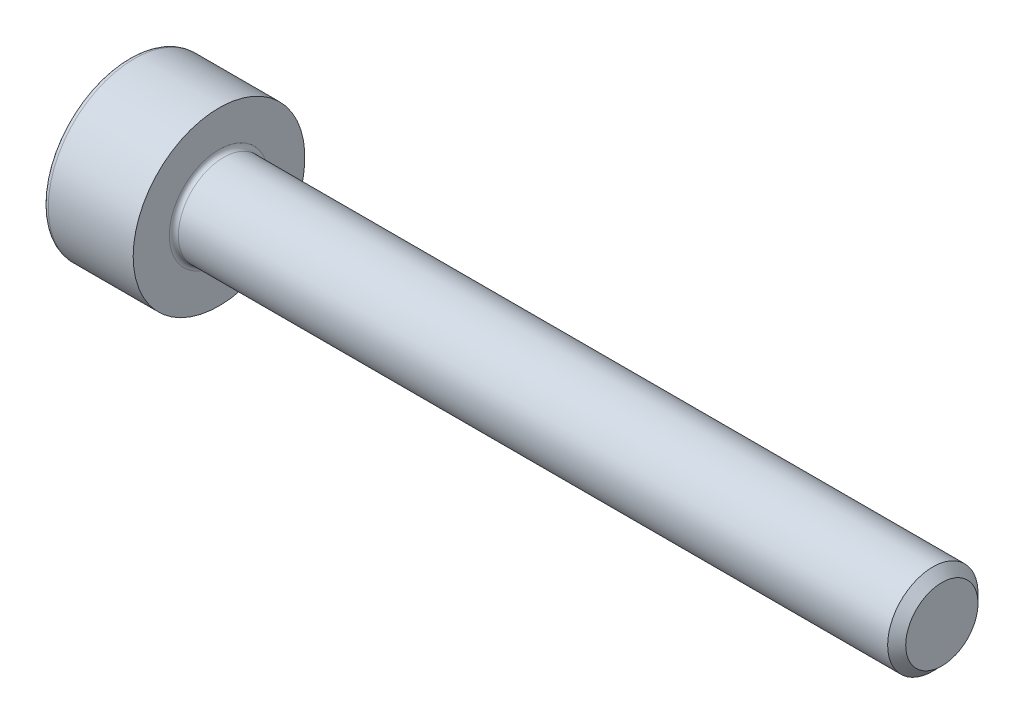
ISO-10303-21;
HEADER;
FILE_DESCRIPTION(('STEP AP214'),'2;1');
FILE_NAME('part.step','',(''),(''),'','','');
FILE_SCHEMA(('AUTOMOTIVE_DESIGN { 1 0 10303 214 1 1 1 1 }'));
ENDSEC;
DATA;
#1=APPLICATION_CONTEXT('core data for automotive mechanical design processes');
#2=APPLICATION_PROTOCOL_DEFINITION('international standard','automotive_design',2000,#1);
#3=PRODUCT_CONTEXT('',#1,'mechanical');
#4=PRODUCT('Part','Part','',(#3));
#5=PRODUCT_RELATED_PRODUCT_CATEGORY('part','',(#4));
#6=PRODUCT_DEFINITION_FORMATION('','',#4);
#7=PRODUCT_DEFINITION_CONTEXT('part definition',#1,'design');
#8=PRODUCT_DEFINITION('design','',#6,#7);
#9=PRODUCT_DEFINITION_SHAPE('','',#8);
#10=(LENGTH_UNIT() NAMED_UNIT(*) SI_UNIT(.MILLI.,.METRE.));
#11=(NAMED_UNIT(*) PLANE_ANGLE_UNIT() SI_UNIT($,.RADIAN.));
#12=(NAMED_UNIT(*) SI_UNIT($,.STERADIAN.) SOLID_ANGLE_UNIT());
#13=UNCERTAINTY_MEASURE_WITH_UNIT(LENGTH_MEASURE(1.E-05),#10,'distance_accuracy_value','');
#14=(GEOMETRIC_REPRESENTATION_CONTEXT(3) GLOBAL_UNCERTAINTY_ASSIGNED_CONTEXT((#13)) GLOBAL_UNIT_ASSIGNED_CONTEXT((#10,
#11,#12)) REPRESENTATION_CONTEXT('',''));
#15=CARTESIAN_POINT('',(0.,0.,0.));
#16=DIRECTION('',(0.,0.,1.));
#17=DIRECTION('',(1.,0.,0.));
#18=AXIS2_PLACEMENT_3D('',#15,#16,#17);
#19=CARTESIAN_POINT('',(18.0000000000048,0.,0.));
#20=DIRECTION('',(-1.,0.,0.));
#21=DIRECTION('',(0.,0.,1.));
#22=AXIS2_PLACEMENT_3D('',#19,#20,#21);
#23=PLANE('',#22);
#24=CARTESIAN_POINT('',(18.0000000000048,0.,0.));
#25=DIRECTION('',(-1.,0.,0.));
#26=DIRECTION('',(0.,0.,1.));
#27=AXIS2_PLACEMENT_3D('',#24,#25,#26);
#28=CIRCLE('',#27,0.800000000000002);
#29=CARTESIAN_POINT('',(18.0000000000048,0.,0.800000000000002));
#30=VERTEX_POINT('',#29);
#31=EDGE_CURVE('E11',#30,#30,#28,.F.);
#32=ORIENTED_EDGE('',*,*,#31,.T.);
#33=EDGE_LOOP('',(#32));
#34=FACE_BOUND('',#33,.T.);
#35=ADVANCED_FACE('F37',(#34),#23,.F.);
#36=CARTESIAN_POINT('',(0.,0.,0.));
#37=DIRECTION('',(-1.,0.,0.));
#38=DIRECTION('',(0.,0.,1.));
#39=AXIS2_PLACEMENT_3D('',#36,#37,#38);
#40=CYLINDRICAL_SURFACE('',#39,1.);
#41=CARTESIAN_POINT('',(17.8000000000048,0.,0.));
#42=DIRECTION('',(-1.,0.,0.));
#43=DIRECTION('',(0.,0.,1.));
#44=AXIS2_PLACEMENT_3D('',#41,#42,#43);
#45=CIRCLE('',#44,1.);
#46=CARTESIAN_POINT('',(17.8000000000048,0.,1.));
#47=VERTEX_POINT('',#46);
#48=EDGE_CURVE('E45',#47,#47,#45,.T.);
#49=ORIENTED_EDGE('',*,*,#48,.T.);
#50=EDGE_LOOP('',(#49));
#51=FACE_BOUND('',#50,.T.);
#52=CARTESIAN_POINT('',(2.10000000000477,0.,0.));
#53=DIRECTION('',(1.,0.,0.));
#54=DIRECTION('',(0.,0.,-1.));
#55=AXIS2_PLACEMENT_3D('',#52,#53,#54);
#56=CIRCLE('',#55,1.);
#57=CARTESIAN_POINT('',(2.10000000000477,0.,-1.));
#58=VERTEX_POINT('',#57);
#59=EDGE_CURVE('E150',#58,#58,#56,.T.);
#60=ORIENTED_EDGE('',*,*,#59,.T.);
#61=EDGE_LOOP('',(#60));
#62=FACE_BOUND('',#61,.T.);
#63=ADVANCED_FACE('F161',(#51,#62),#40,.T.);
#64=CARTESIAN_POINT('',(2.00000000000477,0.,0.));
#65=DIRECTION('',(1.,0.,0.));
#66=DIRECTION('',(0.,0.,-1.));
#67=AXIS2_PLACEMENT_3D('',#64,#65,#66);
#68=PLANE('',#67);
#69=CARTESIAN_POINT('',(2.00000000000477,0.,0.));
#70=DIRECTION('',(1.,0.,0.));
#71=DIRECTION('',(0.,0.,-1.));
#72=AXIS2_PLACEMENT_3D('',#69,#70,#71);
#73=CIRCLE('',#72,1.1);
#74=CARTESIAN_POINT('',(2.00000000000477,0.,-1.1));
#75=VERTEX_POINT('',#74);
#76=EDGE_CURVE('E147',#75,#75,#73,.F.);
#77=ORIENTED_EDGE('',*,*,#76,.T.);
#78=EDGE_LOOP('',(#77));
#79=FACE_BOUND('',#78,.T.);
#80=CARTESIAN_POINT('',(2.00000000000477,0.,0.));
#81=DIRECTION('',(-1.,0.,0.));
#82=DIRECTION('',(0.,0.,1.));
#83=AXIS2_PLACEMENT_3D('',#80,#81,#82);
#84=CIRCLE('',#83,1.9);
#85=CARTESIAN_POINT('',(2.00000000000477,0.,1.9));
#86=VERTEX_POINT('',#85);
#87=EDGE_CURVE('E139',#86,#86,#84,.T.);
#88=ORIENTED_EDGE('',*,*,#87,.F.);
#89=EDGE_LOOP('',(#88));
#90=FACE_BOUND('',#89,.T.);
#91=ADVANCED_FACE('F183',(#79,#90),#68,.T.);
#92=CARTESIAN_POINT('',(0.,0.,0.));
#93=DIRECTION('',(-1.,0.,0.));
#94=DIRECTION('',(0.,0.,1.));
#95=AXIS2_PLACEMENT_3D('',#92,#93,#94);
#96=CYLINDRICAL_SURFACE('',#95,1.9);
#97=CARTESIAN_POINT('',(0.12,0.,0.));
#98=DIRECTION('',(-1.,0.,0.));
#99=DIRECTION('',(0.,0.,1.));
#100=AXIS2_PLACEMENT_3D('',#97,#98,#99);
#101=CIRCLE('',#100,1.9);
#102=CARTESIAN_POINT('',(0.12,0.,1.9));
#103=VERTEX_POINT('',#102);
#104=EDGE_CURVE('E156',#103,#103,#101,.F.);
#105=ORIENTED_EDGE('',*,*,#104,.T.);
#106=EDGE_LOOP('',(#105));
#107=FACE_BOUND('',#106,.T.);
#108=ORIENTED_EDGE('',*,*,#87,.T.);
#109=EDGE_LOOP('',(#108));
#110=FACE_BOUND('',#109,.T.);
#111=ADVANCED_FACE('F193',(#107,#110),#96,.T.);
#112=CARTESIAN_POINT('',(0.,0.,0.));
#113=DIRECTION('',(-1.,0.,0.));
#114=DIRECTION('',(0.,0.,1.));
#115=AXIS2_PLACEMENT_3D('',#112,#113,#114);
#116=PLANE('',#115);
#117=DIRECTION('',(0.,0.5,-0.866025403784439));
#118=VECTOR('',#117,1.);
#119=CARTESIAN_POINT('',(0.,0.43301270189222,0.749999999999999));
#120=LINE('',#119,#118);
#121=CARTESIAN_POINT('',(0.,0.43301270189222,0.749999999999999));
#122=VERTEX_POINT('',#121);
#123=CARTESIAN_POINT('',(0.,0.866025403784438,0.));
#124=VERTEX_POINT('',#123);
#125=EDGE_CURVE('E52',#122,#124,#120,.T.);
#126=ORIENTED_EDGE('',*,*,#125,.F.);
#127=DIRECTION('',(0.,1.,0.));
#128=VECTOR('',#127,1.);
#129=CARTESIAN_POINT('',(0.,-0.43301270189222,0.749999999999999));
#130=LINE('',#129,#128);
#131=CARTESIAN_POINT('',(0.,-0.43301270189222,0.749999999999999));
#132=VERTEX_POINT('',#131);
#133=EDGE_CURVE('E135',#132,#122,#130,.T.);
#134=ORIENTED_EDGE('',*,*,#133,.F.);
#135=DIRECTION('',(0.,0.5,0.866025403784439));
#136=VECTOR('',#135,1.);
#137=CARTESIAN_POINT('',(0.,-0.866025403784438,0.));
#138=LINE('',#137,#136);
#139=CARTESIAN_POINT('',(0.,-0.866025403784438,0.));
#140=VERTEX_POINT('',#139);
#141=EDGE_CURVE('E133',#140,#132,#138,.T.);
#142=ORIENTED_EDGE('',*,*,#141,.F.);
#143=DIRECTION('',(0.,-0.5,0.866025403784439));
#144=VECTOR('',#143,1.);
#145=CARTESIAN_POINT('',(0.,-0.433012701892219,-0.75));
#146=LINE('',#145,#144);
#147=CARTESIAN_POINT('',(0.,-0.433012701892219,-0.75));
#148=VERTEX_POINT('',#147);
#149=EDGE_CURVE('E100',#148,#140,#146,.T.);
#150=ORIENTED_EDGE('',*,*,#149,.F.);
#151=DIRECTION('',(0.,-1.,0.));
#152=VECTOR('',#151,1.);
#153=CARTESIAN_POINT('',(0.,0.433012701892219,-0.75));
#154=LINE('',#153,#152);
#155=CARTESIAN_POINT('',(0.,0.433012701892219,-0.75));
#156=VERTEX_POINT('',#155);
#157=EDGE_CURVE('E129',#156,#148,#154,.T.);
#158=ORIENTED_EDGE('',*,*,#157,.F.);
#159=DIRECTION('',(0.,-0.5,-0.866025403784439));
#160=VECTOR('',#159,1.);
#161=CARTESIAN_POINT('',(0.,0.866025403784438,0.));
#162=LINE('',#161,#160);
#163=EDGE_CURVE('E126',#124,#156,#162,.T.);
#164=ORIENTED_EDGE('',*,*,#163,.F.);
#165=EDGE_LOOP('',(#126,#134,#142,#150,#158,#164));
#166=FACE_BOUND('',#165,.T.);
#167=CARTESIAN_POINT('',(0.,0.,0.));
#168=DIRECTION('',(-1.,0.,0.));
#169=DIRECTION('',(0.,0.,1.));
#170=AXIS2_PLACEMENT_3D('',#167,#168,#169);
#171=CIRCLE('',#170,1.78);
#172=CARTESIAN_POINT('',(0.,0.,1.78));
#173=VERTEX_POINT('',#172);
#174=EDGE_CURVE('E153',#173,#173,#171,.T.);
#175=ORIENTED_EDGE('',*,*,#174,.T.);
#176=EDGE_LOOP('',(#175));
#177=FACE_BOUND('',#176,.T.);
#178=ADVANCED_FACE('F188',(#166,#177),#116,.T.);
#179=CARTESIAN_POINT('',(2.10000000000477,0.,0.));
#180=DIRECTION('',(1.,0.,0.));
#181=DIRECTION('',(0.,0.,-1.));
#182=AXIS2_PLACEMENT_3D('',#179,#180,#181);
#183=TOROIDAL_SURFACE('',#182,1.1,0.1);
#184=ORIENTED_EDGE('',*,*,#59,.F.);
#185=EDGE_LOOP('',(#184));
#186=FACE_BOUND('',#185,.T.);
#187=ORIENTED_EDGE('',*,*,#76,.F.);
#188=EDGE_LOOP('',(#187));
#189=FACE_BOUND('',#188,.T.);
#190=ADVANCED_FACE('F174',(#186,#189),#183,.F.);
#191=CARTESIAN_POINT('',(0.12,0.,0.));
#192=DIRECTION('',(-1.,0.,0.));
#193=DIRECTION('',(0.,0.,1.));
#194=AXIS2_PLACEMENT_3D('',#191,#192,#193);
#195=TOROIDAL_SURFACE('',#194,1.78,0.12);
#196=ORIENTED_EDGE('',*,*,#104,.F.);
#197=EDGE_LOOP('',(#196));
#198=FACE_BOUND('',#197,.T.);
#199=ORIENTED_EDGE('',*,*,#174,.F.);
#200=EDGE_LOOP('',(#199));
#201=FACE_BOUND('',#200,.T.);
#202=ADVANCED_FACE('F166',(#198,#201),#195,.T.);
#203=CARTESIAN_POINT('',(17.8000000000048,0.,0.));
#204=DIRECTION('',(-1.,0.,0.));
#205=DIRECTION('',(0.,0.,1.));
#206=AXIS2_PLACEMENT_3D('',#203,#204,#205);
#207=CONICAL_SURFACE('',#206,1.,0.785398163397449);
#208=ORIENTED_EDGE('',*,*,#31,.F.);
#209=EDGE_LOOP('',(#208));
#210=FACE_BOUND('',#209,.T.);
#211=ORIENTED_EDGE('',*,*,#48,.F.);
#212=EDGE_LOOP('',(#211));
#213=FACE_BOUND('',#212,.T.);
#214=ADVANCED_FACE('F39',(#210,#213),#207,.T.);
#215=CARTESIAN_POINT('',(1.,0.43301270189222,0.749999999999999));
#216=DIRECTION('',(0.,0.866025403784439,0.5));
#217=DIRECTION('',(0.,-0.5,0.866025403784439));
#218=AXIS2_PLACEMENT_3D('',#215,#216,#217);
#219=PLANE('',#218);
#220=ORIENTED_EDGE('',*,*,#125,.T.);
#221=DIRECTION('',(-1.,0.,0.));
#222=VECTOR('',#221,1.);
#223=CARTESIAN_POINT('',(1.,0.866025403784438,0.));
#224=LINE('',#223,#222);
#225=CARTESIAN_POINT('',(1.,0.866025403784438,0.));
#226=VERTEX_POINT('',#225);
#227=EDGE_CURVE('E82',#226,#124,#224,.T.);
#228=ORIENTED_EDGE('',*,*,#227,.F.);
#229=DIRECTION('',(0.,0.5,-0.866025403784439));
#230=VECTOR('',#229,1.);
#231=CARTESIAN_POINT('',(1.,0.43301270189222,0.749999999999999));
#232=LINE('',#231,#230);
#233=CARTESIAN_POINT('',(1.,0.43301270189222,0.749999999999999));
#234=VERTEX_POINT('',#233);
#235=EDGE_CURVE('E137',#234,#226,#232,.T.);
#236=ORIENTED_EDGE('',*,*,#235,.F.);
#237=DIRECTION('',(-1.,0.,0.));
#238=VECTOR('',#237,1.);
#239=CARTESIAN_POINT('',(1.,0.43301270189222,0.749999999999999));
#240=LINE('',#239,#238);
#241=EDGE_CURVE('E60',#234,#122,#240,.T.);
#242=ORIENTED_EDGE('',*,*,#241,.T.);
#243=EDGE_LOOP('',(#220,#228,#236,#242));
#244=FACE_BOUND('',#243,.T.);
#245=ADVANCED_FACE('F165',(#244),#219,.F.);
#246=CARTESIAN_POINT('',(1.,-0.43301270189222,0.749999999999999));
#247=DIRECTION('',(0.,0.,1.));
#248=DIRECTION('',(0.,-1.,0.));
#249=AXIS2_PLACEMENT_3D('',#246,#247,#248);
#250=PLANE('',#249);
#251=ORIENTED_EDGE('',*,*,#133,.T.);
#252=ORIENTED_EDGE('',*,*,#241,.F.);
#253=DIRECTION('',(0.,1.,0.));
#254=VECTOR('',#253,1.);
#255=CARTESIAN_POINT('',(1.,-0.43301270189222,0.749999999999999));
#256=LINE('',#255,#254);
#257=CARTESIAN_POINT('',(1.,-0.43301270189222,0.749999999999999));
#258=VERTEX_POINT('',#257);
#259=EDGE_CURVE('E112',#258,#234,#256,.T.);
#260=ORIENTED_EDGE('',*,*,#259,.F.);
#261=DIRECTION('',(-1.,0.,0.));
#262=VECTOR('',#261,1.);
#263=CARTESIAN_POINT('',(1.,-0.43301270189222,0.749999999999999));
#264=LINE('',#263,#262);
#265=EDGE_CURVE('E104',#258,#132,#264,.T.);
#266=ORIENTED_EDGE('',*,*,#265,.T.);
#267=EDGE_LOOP('',(#251,#252,#260,#266));
#268=FACE_BOUND('',#267,.T.);
#269=ADVANCED_FACE('F172',(#268),#250,.F.);
#270=CARTESIAN_POINT('',(1.,-0.866025403784438,0.));
#271=DIRECTION('',(0.,-0.866025403784439,0.5));
#272=DIRECTION('',(0.,-0.5,-0.866025403784439));
#273=AXIS2_PLACEMENT_3D('',#270,#271,#272);
#274=PLANE('',#273);
#275=ORIENTED_EDGE('',*,*,#141,.T.);
#276=ORIENTED_EDGE('',*,*,#265,.F.);
#277=DIRECTION('',(0.,0.5,0.866025403784439));
#278=VECTOR('',#277,1.);
#279=CARTESIAN_POINT('',(1.,-0.866025403784438,0.));
#280=LINE('',#279,#278);
#281=CARTESIAN_POINT('',(1.,-0.866025403784438,0.));
#282=VERTEX_POINT('',#281);
#283=EDGE_CURVE('E108',#282,#258,#280,.T.);
#284=ORIENTED_EDGE('',*,*,#283,.F.);
#285=DIRECTION('',(-1.,0.,0.));
#286=VECTOR('',#285,1.);
#287=CARTESIAN_POINT('',(1.,-0.866025403784438,0.));
#288=LINE('',#287,#286);
#289=EDGE_CURVE('E93',#282,#140,#288,.T.);
#290=ORIENTED_EDGE('',*,*,#289,.T.);
#291=EDGE_LOOP('',(#275,#276,#284,#290));
#292=FACE_BOUND('',#291,.T.);
#293=ADVANCED_FACE('F109',(#292),#274,.F.);
#294=CARTESIAN_POINT('',(1.,-0.433012701892219,-0.75));
#295=DIRECTION('',(0.,-0.866025403784439,-0.5));
#296=DIRECTION('',(0.,0.5,-0.866025403784439));
#297=AXIS2_PLACEMENT_3D('',#294,#295,#296);
#298=PLANE('',#297);
#299=ORIENTED_EDGE('',*,*,#149,.T.);
#300=ORIENTED_EDGE('',*,*,#289,.F.);
#301=DIRECTION('',(0.,-0.5,0.866025403784439));
#302=VECTOR('',#301,1.);
#303=CARTESIAN_POINT('',(1.,-0.433012701892219,-0.75));
#304=LINE('',#303,#302);
#305=CARTESIAN_POINT('',(1.,-0.433012701892219,-0.75));
#306=VERTEX_POINT('',#305);
#307=EDGE_CURVE('E97',#306,#282,#304,.T.);
#308=ORIENTED_EDGE('',*,*,#307,.F.);
#309=DIRECTION('',(-1.,0.,0.));
#310=VECTOR('',#309,1.);
#311=CARTESIAN_POINT('',(1.,-0.433012701892219,-0.75));
#312=LINE('',#311,#310);
#313=EDGE_CURVE('E105',#306,#148,#312,.T.);
#314=ORIENTED_EDGE('',*,*,#313,.T.);
#315=EDGE_LOOP('',(#299,#300,#308,#314));
#316=FACE_BOUND('',#315,.T.);
#317=ADVANCED_FACE('F95',(#316),#298,.F.);
#318=CARTESIAN_POINT('',(1.,0.433012701892219,-0.75));
#319=DIRECTION('',(0.,0.,-1.));
#320=DIRECTION('',(0.,1.,0.));
#321=AXIS2_PLACEMENT_3D('',#318,#319,#320);
#322=PLANE('',#321);
#323=ORIENTED_EDGE('',*,*,#157,.T.);
#324=ORIENTED_EDGE('',*,*,#313,.F.);
#325=DIRECTION('',(0.,-1.,0.));
#326=VECTOR('',#325,1.);
#327=CARTESIAN_POINT('',(1.,0.433012701892219,-0.75));
#328=LINE('',#327,#326);
#329=CARTESIAN_POINT('',(1.,0.433012701892219,-0.75));
#330=VERTEX_POINT('',#329);
#331=EDGE_CURVE('E118',#330,#306,#328,.T.);
#332=ORIENTED_EDGE('',*,*,#331,.F.);
#333=DIRECTION('',(-1.,0.,0.));
#334=VECTOR('',#333,1.);
#335=CARTESIAN_POINT('',(1.,0.433012701892219,-0.75));
#336=LINE('',#335,#334);
#337=EDGE_CURVE('E142',#330,#156,#336,.T.);
#338=ORIENTED_EDGE('',*,*,#337,.T.);
#339=EDGE_LOOP('',(#323,#324,#332,#338));
#340=FACE_BOUND('',#339,.T.);
#341=ADVANCED_FACE('F213',(#340),#322,.F.);
#342=CARTESIAN_POINT('',(1.,0.866025403784438,0.));
#343=DIRECTION('',(0.,0.866025403784439,-0.5));
#344=DIRECTION('',(0.,0.5,0.866025403784439));
#345=AXIS2_PLACEMENT_3D('',#342,#343,#344);
#346=PLANE('',#345);
#347=ORIENTED_EDGE('',*,*,#163,.T.);
#348=ORIENTED_EDGE('',*,*,#337,.F.);
#349=DIRECTION('',(0.,-0.5,-0.866025403784439));
#350=VECTOR('',#349,1.);
#351=CARTESIAN_POINT('',(1.,0.866025403784438,0.));
#352=LINE('',#351,#350);
#353=EDGE_CURVE('E120',#226,#330,#352,.T.);
#354=ORIENTED_EDGE('',*,*,#353,.F.);
#355=ORIENTED_EDGE('',*,*,#227,.T.);
#356=EDGE_LOOP('',(#347,#348,#354,#355));
#357=FACE_BOUND('',#356,.T.);
#358=ADVANCED_FACE('F210',(#357),#346,.F.);
#359=CARTESIAN_POINT('',(1.,0.,0.));
#360=DIRECTION('',(-1.,0.,0.));
#361=DIRECTION('',(0.,0.,1.));
#362=AXIS2_PLACEMENT_3D('',#359,#360,#361);
#363=PLANE('',#362);
#364=ORIENTED_EDGE('',*,*,#235,.T.);
#365=ORIENTED_EDGE('',*,*,#353,.T.);
#366=ORIENTED_EDGE('',*,*,#331,.T.);
#367=ORIENTED_EDGE('',*,*,#307,.T.);
#368=ORIENTED_EDGE('',*,*,#283,.T.);
#369=ORIENTED_EDGE('',*,*,#259,.T.);
#370=EDGE_LOOP('',(#364,#365,#366,#367,#368,#369));
#371=FACE_BOUND('',#370,.T.);
#372=ADVANCED_FACE('F115',(#371),#363,.T.);
#373=CLOSED_SHELL('',(#35,#63,#91,#111,#178,#190,#202,#214,#245,#269,#293,#317,#341,#358,#372));
#374=MANIFOLD_SOLID_BREP('B2',#373);
#375=ADVANCED_BREP_SHAPE_REPRESENTATION('',(#18,#374),#14);
#376=SHAPE_DEFINITION_REPRESENTATION(#9,#375);
ENDSEC;
END-ISO-10303-21;
